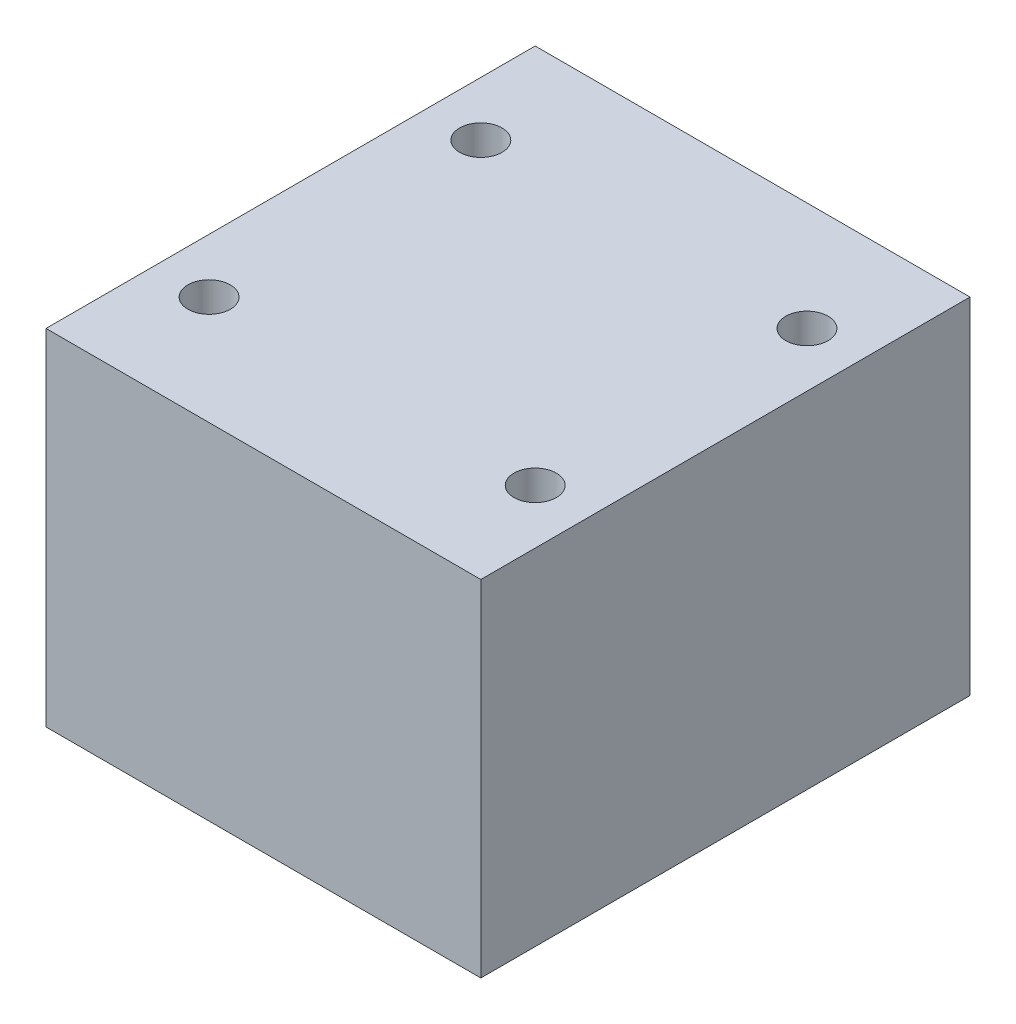
ISO-10303-21;
HEADER;
FILE_DESCRIPTION(('STEP AP214'),'2;1');
FILE_NAME('part.step','',(''),(''),'','','');
FILE_SCHEMA(('AUTOMOTIVE_DESIGN { 1 0 10303 214 1 1 1 1 }'));
ENDSEC;
DATA;
#1=APPLICATION_CONTEXT('core data for automotive mechanical design processes');
#2=APPLICATION_PROTOCOL_DEFINITION('international standard','automotive_design',2000,#1);
#3=PRODUCT_CONTEXT('',#1,'mechanical');
#4=PRODUCT('Part','Part','',(#3));
#5=PRODUCT_RELATED_PRODUCT_CATEGORY('part','',(#4));
#6=PRODUCT_DEFINITION_FORMATION('','',#4);
#7=PRODUCT_DEFINITION_CONTEXT('part definition',#1,'design');
#8=PRODUCT_DEFINITION('design','',#6,#7);
#9=PRODUCT_DEFINITION_SHAPE('','',#8);
#10=(LENGTH_UNIT() NAMED_UNIT(*) SI_UNIT(.MILLI.,.METRE.));
#11=(NAMED_UNIT(*) PLANE_ANGLE_UNIT() SI_UNIT($,.RADIAN.));
#12=(NAMED_UNIT(*) SI_UNIT($,.STERADIAN.) SOLID_ANGLE_UNIT());
#13=UNCERTAINTY_MEASURE_WITH_UNIT(LENGTH_MEASURE(1.E-05),#10,'distance_accuracy_value','');
#14=(GEOMETRIC_REPRESENTATION_CONTEXT(3) GLOBAL_UNCERTAINTY_ASSIGNED_CONTEXT((#13)) GLOBAL_UNIT_ASSIGNED_CONTEXT((#10,
#11,#12)) REPRESENTATION_CONTEXT('',''));
#15=CARTESIAN_POINT('',(0.,0.,0.));
#16=DIRECTION('',(0.,0.,1.));
#17=DIRECTION('',(1.,0.,0.));
#18=AXIS2_PLACEMENT_3D('',#15,#16,#17);
#19=CARTESIAN_POINT('',(0.,31.75,0.));
#20=DIRECTION('',(0.,-1.,0.));
#21=DIRECTION('',(0.,0.,-1.));
#22=AXIS2_PLACEMENT_3D('',#19,#20,#21);
#23=PLANE('',#22);
#24=DIRECTION('',(0.,0.,1.));
#25=VECTOR('',#24,1.);
#26=CARTESIAN_POINT('',(-10.8661157330131,31.75,15.721947224945));
#27=LINE('',#26,#25);
#28=CARTESIAN_POINT('',(-10.8661157330131,31.75,-29.278052775055));
#29=VERTEX_POINT('',#28);
#30=CARTESIAN_POINT('',(-10.8661157330131,31.75,15.721947224945));
#31=VERTEX_POINT('',#30);
#32=EDGE_CURVE('E97',#29,#31,#27,.T.);
#33=ORIENTED_EDGE('',*,*,#32,.T.);
#34=DIRECTION('',(1.,0.,0.));
#35=VECTOR('',#34,1.);
#36=CARTESIAN_POINT('',(-10.8661157330131,31.75,15.721947224945));
#37=LINE('',#36,#35);
#38=CARTESIAN_POINT('',(29.1338842669869,31.75,15.721947224945));
#39=VERTEX_POINT('',#38);
#40=EDGE_CURVE('E93',#31,#39,#37,.T.);
#41=ORIENTED_EDGE('',*,*,#40,.T.);
#42=DIRECTION('',(0.,0.,-1.));
#43=VECTOR('',#42,1.);
#44=CARTESIAN_POINT('',(29.1338842669869,31.75,15.721947224945));
#45=LINE('',#44,#43);
#46=CARTESIAN_POINT('',(29.1338842669869,31.75,-29.278052775055));
#47=VERTEX_POINT('',#46);
#48=EDGE_CURVE('E96',#39,#47,#45,.T.);
#49=ORIENTED_EDGE('',*,*,#48,.T.);
#50=DIRECTION('',(-1.,0.,0.));
#51=VECTOR('',#50,1.);
#52=CARTESIAN_POINT('',(-10.8661157330131,31.75,-29.278052775055));
#53=LINE('',#52,#51);
#54=EDGE_CURVE('E64',#47,#29,#53,.T.);
#55=ORIENTED_EDGE('',*,*,#54,.T.);
#56=EDGE_LOOP('',(#33,#41,#49,#55));
#57=FACE_BOUND('',#56,.T.);
#58=CARTESIAN_POINT('',(-5.86611573301306,31.75,-19.278052775055));
#59=DIRECTION('',(0.,1.,0.));
#60=DIRECTION('',(0.,0.,1.));
#61=AXIS2_PLACEMENT_3D('',#58,#59,#60);
#62=CIRCLE('',#61,1.95);
#63=CARTESIAN_POINT('',(-5.86611573301306,31.75,-17.328052775055));
#64=VERTEX_POINT('',#63);
#65=EDGE_CURVE('E119',#64,#64,#62,.T.);
#66=ORIENTED_EDGE('',*,*,#65,.F.);
#67=EDGE_LOOP('',(#66));
#68=FACE_BOUND('',#67,.T.);
#69=CARTESIAN_POINT('',(24.1338842669869,31.75,-19.278052775055));
#70=DIRECTION('',(0.,1.,0.));
#71=DIRECTION('',(0.,0.,1.));
#72=AXIS2_PLACEMENT_3D('',#69,#70,#71);
#73=CIRCLE('',#72,1.95);
#74=CARTESIAN_POINT('',(24.1338842669869,31.75,-17.328052775055));
#75=VERTEX_POINT('',#74);
#76=EDGE_CURVE('E139',#75,#75,#73,.T.);
#77=ORIENTED_EDGE('',*,*,#76,.F.);
#78=EDGE_LOOP('',(#77));
#79=FACE_BOUND('',#78,.T.);
#80=CARTESIAN_POINT('',(24.1338842669869,31.75,5.72194722494503));
#81=DIRECTION('',(0.,1.,0.));
#82=DIRECTION('',(0.,0.,1.));
#83=AXIS2_PLACEMENT_3D('',#80,#81,#82);
#84=CIRCLE('',#83,1.95);
#85=CARTESIAN_POINT('',(24.1338842669869,31.75,7.67194722494503));
#86=VERTEX_POINT('',#85);
#87=EDGE_CURVE('E149',#86,#86,#84,.T.);
#88=ORIENTED_EDGE('',*,*,#87,.F.);
#89=EDGE_LOOP('',(#88));
#90=FACE_BOUND('',#89,.T.);
#91=CARTESIAN_POINT('',(-5.86611573301306,31.75,5.72194722494503));
#92=DIRECTION('',(0.,1.,0.));
#93=DIRECTION('',(0.,0.,1.));
#94=AXIS2_PLACEMENT_3D('',#91,#92,#93);
#95=CIRCLE('',#94,1.95);
#96=CARTESIAN_POINT('',(-5.86611573301306,31.75,7.67194722494503));
#97=VERTEX_POINT('',#96);
#98=EDGE_CURVE('E157',#97,#97,#95,.T.);
#99=ORIENTED_EDGE('',*,*,#98,.F.);
#100=EDGE_LOOP('',(#99));
#101=FACE_BOUND('',#100,.T.);
#102=ADVANCED_FACE('F44',(#57,#68,#79,#90,#101),#23,.F.);
#103=CARTESIAN_POINT('',(0.,0.,0.));
#104=DIRECTION('',(0.,-1.,0.));
#105=DIRECTION('',(0.,0.,-1.));
#106=AXIS2_PLACEMENT_3D('',#103,#104,#105);
#107=PLANE('',#106);
#108=CARTESIAN_POINT('',(24.1338842669869,0.,5.72194722494503));
#109=DIRECTION('',(0.,1.,0.));
#110=DIRECTION('',(0.,0.,1.));
#111=AXIS2_PLACEMENT_3D('',#108,#109,#110);
#112=CIRCLE('',#111,1.95);
#113=CARTESIAN_POINT('',(24.1338842669869,0.,7.67194722494503));
#114=VERTEX_POINT('',#113);
#115=EDGE_CURVE('E152',#114,#114,#112,.T.);
#116=ORIENTED_EDGE('',*,*,#115,.T.);
#117=EDGE_LOOP('',(#116));
#118=FACE_BOUND('',#117,.T.);
#119=CARTESIAN_POINT('',(-5.86611573301306,0.,-19.278052775055));
#120=DIRECTION('',(0.,1.,0.));
#121=DIRECTION('',(0.,0.,1.));
#122=AXIS2_PLACEMENT_3D('',#119,#120,#121);
#123=CIRCLE('',#122,1.95);
#124=CARTESIAN_POINT('',(-5.86611573301306,0.,-17.328052775055));
#125=VERTEX_POINT('',#124);
#126=EDGE_CURVE('E136',#125,#125,#123,.T.);
#127=ORIENTED_EDGE('',*,*,#126,.T.);
#128=EDGE_LOOP('',(#127));
#129=FACE_BOUND('',#128,.T.);
#130=DIRECTION('',(0.,0.,1.));
#131=VECTOR('',#130,1.);
#132=CARTESIAN_POINT('',(-10.8661157330131,0.,15.721947224945));
#133=LINE('',#132,#131);
#134=CARTESIAN_POINT('',(-10.8661157330131,0.,-29.278052775055));
#135=VERTEX_POINT('',#134);
#136=CARTESIAN_POINT('',(-10.8661157330131,0.,15.721947224945));
#137=VERTEX_POINT('',#136);
#138=EDGE_CURVE('E114',#135,#137,#133,.T.);
#139=ORIENTED_EDGE('',*,*,#138,.F.);
#140=DIRECTION('',(-1.,0.,0.));
#141=VECTOR('',#140,1.);
#142=CARTESIAN_POINT('',(-10.8661157330131,0.,-29.278052775055));
#143=LINE('',#142,#141);
#144=CARTESIAN_POINT('',(29.1338842669869,0.,-29.278052775055));
#145=VERTEX_POINT('',#144);
#146=EDGE_CURVE('E86',#145,#135,#143,.T.);
#147=ORIENTED_EDGE('',*,*,#146,.F.);
#148=DIRECTION('',(0.,0.,-1.));
#149=VECTOR('',#148,1.);
#150=CARTESIAN_POINT('',(29.1338842669869,0.,15.721947224945));
#151=LINE('',#150,#149);
#152=CARTESIAN_POINT('',(29.1338842669869,0.,15.721947224945));
#153=VERTEX_POINT('',#152);
#154=EDGE_CURVE('E79',#153,#145,#151,.T.);
#155=ORIENTED_EDGE('',*,*,#154,.F.);
#156=DIRECTION('',(1.,0.,0.));
#157=VECTOR('',#156,1.);
#158=CARTESIAN_POINT('',(-10.8661157330131,0.,15.721947224945));
#159=LINE('',#158,#157);
#160=EDGE_CURVE('E104',#137,#153,#159,.T.);
#161=ORIENTED_EDGE('',*,*,#160,.F.);
#162=EDGE_LOOP('',(#139,#147,#155,#161));
#163=FACE_BOUND('',#162,.T.);
#164=CARTESIAN_POINT('',(24.1338842669869,0.,-19.278052775055));
#165=DIRECTION('',(0.,1.,0.));
#166=DIRECTION('',(0.,0.,1.));
#167=AXIS2_PLACEMENT_3D('',#164,#165,#166);
#168=CIRCLE('',#167,1.95);
#169=CARTESIAN_POINT('',(24.1338842669869,0.,-17.328052775055));
#170=VERTEX_POINT('',#169);
#171=EDGE_CURVE('E143',#170,#170,#168,.T.);
#172=ORIENTED_EDGE('',*,*,#171,.T.);
#173=EDGE_LOOP('',(#172));
#174=FACE_BOUND('',#173,.T.);
#175=CARTESIAN_POINT('',(-5.86611573301306,0.,5.72194722494503));
#176=DIRECTION('',(0.,1.,0.));
#177=DIRECTION('',(0.,0.,1.));
#178=AXIS2_PLACEMENT_3D('',#175,#176,#177);
#179=CIRCLE('',#178,1.95);
#180=CARTESIAN_POINT('',(-5.86611573301306,0.,7.67194722494503));
#181=VERTEX_POINT('',#180);
#182=EDGE_CURVE('E158',#181,#181,#179,.T.);
#183=ORIENTED_EDGE('',*,*,#182,.T.);
#184=EDGE_LOOP('',(#183));
#185=FACE_BOUND('',#184,.T.);
#186=ADVANCED_FACE('F131',(#118,#129,#163,#174,#185),#107,.T.);
#187=CARTESIAN_POINT('',(-10.8661157330131,31.75,15.721947224945));
#188=DIRECTION('',(1.,0.,0.));
#189=DIRECTION('',(0.,0.,-1.));
#190=AXIS2_PLACEMENT_3D('',#187,#188,#189);
#191=PLANE('',#190);
#192=ORIENTED_EDGE('',*,*,#138,.T.);
#193=DIRECTION('',(0.,-1.,0.));
#194=VECTOR('',#193,1.);
#195=CARTESIAN_POINT('',(-10.8661157330131,31.75,15.721947224945));
#196=LINE('',#195,#194);
#197=EDGE_CURVE('E11',#31,#137,#196,.T.);
#198=ORIENTED_EDGE('',*,*,#197,.F.);
#199=ORIENTED_EDGE('',*,*,#32,.F.);
#200=DIRECTION('',(0.,-1.,0.));
#201=VECTOR('',#200,1.);
#202=CARTESIAN_POINT('',(-10.8661157330131,31.75,-29.278052775055));
#203=LINE('',#202,#201);
#204=EDGE_CURVE('E110',#29,#135,#203,.T.);
#205=ORIENTED_EDGE('',*,*,#204,.T.);
#206=EDGE_LOOP('',(#192,#198,#199,#205));
#207=FACE_BOUND('',#206,.T.);
#208=ADVANCED_FACE('F50',(#207),#191,.F.);
#209=CARTESIAN_POINT('',(-10.8661157330131,31.75,15.721947224945));
#210=DIRECTION('',(0.,0.,-1.));
#211=DIRECTION('',(-1.,0.,0.));
#212=AXIS2_PLACEMENT_3D('',#209,#210,#211);
#213=PLANE('',#212);
#214=ORIENTED_EDGE('',*,*,#160,.T.);
#215=DIRECTION('',(0.,-1.,0.));
#216=VECTOR('',#215,1.);
#217=CARTESIAN_POINT('',(29.1338842669869,31.75,15.721947224945));
#218=LINE('',#217,#216);
#219=EDGE_CURVE('E54',#39,#153,#218,.T.);
#220=ORIENTED_EDGE('',*,*,#219,.F.);
#221=ORIENTED_EDGE('',*,*,#40,.F.);
#222=ORIENTED_EDGE('',*,*,#197,.T.);
#223=EDGE_LOOP('',(#214,#220,#221,#222));
#224=FACE_BOUND('',#223,.T.);
#225=ADVANCED_FACE('F105',(#224),#213,.F.);
#226=CARTESIAN_POINT('',(29.1338842669869,31.75,15.721947224945));
#227=DIRECTION('',(-1.,0.,0.));
#228=DIRECTION('',(0.,0.,1.));
#229=AXIS2_PLACEMENT_3D('',#226,#227,#228);
#230=PLANE('',#229);
#231=ORIENTED_EDGE('',*,*,#154,.T.);
#232=DIRECTION('',(0.,-1.,0.));
#233=VECTOR('',#232,1.);
#234=CARTESIAN_POINT('',(29.1338842669869,31.75,-29.278052775055));
#235=LINE('',#234,#233);
#236=EDGE_CURVE('E103',#47,#145,#235,.T.);
#237=ORIENTED_EDGE('',*,*,#236,.F.);
#238=ORIENTED_EDGE('',*,*,#48,.F.);
#239=ORIENTED_EDGE('',*,*,#219,.T.);
#240=EDGE_LOOP('',(#231,#237,#238,#239));
#241=FACE_BOUND('',#240,.T.);
#242=ADVANCED_FACE('F106',(#241),#230,.F.);
#243=CARTESIAN_POINT('',(-10.8661157330131,31.75,-29.278052775055));
#244=DIRECTION('',(0.,0.,1.));
#245=DIRECTION('',(1.,0.,0.));
#246=AXIS2_PLACEMENT_3D('',#243,#244,#245);
#247=PLANE('',#246);
#248=ORIENTED_EDGE('',*,*,#146,.T.);
#249=ORIENTED_EDGE('',*,*,#204,.F.);
#250=ORIENTED_EDGE('',*,*,#54,.F.);
#251=ORIENTED_EDGE('',*,*,#236,.T.);
#252=EDGE_LOOP('',(#248,#249,#250,#251));
#253=FACE_BOUND('',#252,.T.);
#254=ADVANCED_FACE('F126',(#253),#247,.F.);
#255=CARTESIAN_POINT('',(-5.86611573301306,31.75,-19.278052775055));
#256=DIRECTION('',(0.,-1.,0.));
#257=DIRECTION('',(0.,0.,-1.));
#258=AXIS2_PLACEMENT_3D('',#255,#256,#257);
#259=CYLINDRICAL_SURFACE('',#258,1.95);
#260=ORIENTED_EDGE('',*,*,#65,.T.);
#261=EDGE_LOOP('',(#260));
#262=FACE_BOUND('',#261,.T.);
#263=ORIENTED_EDGE('',*,*,#126,.F.);
#264=EDGE_LOOP('',(#263));
#265=FACE_BOUND('',#264,.T.);
#266=ADVANCED_FACE('F177',(#262,#265),#259,.F.);
#267=CARTESIAN_POINT('',(24.1338842669869,31.75,-19.278052775055));
#268=DIRECTION('',(0.,-1.,0.));
#269=DIRECTION('',(0.,0.,-1.));
#270=AXIS2_PLACEMENT_3D('',#267,#268,#269);
#271=CYLINDRICAL_SURFACE('',#270,1.95);
#272=ORIENTED_EDGE('',*,*,#76,.T.);
#273=EDGE_LOOP('',(#272));
#274=FACE_BOUND('',#273,.T.);
#275=ORIENTED_EDGE('',*,*,#171,.F.);
#276=EDGE_LOOP('',(#275));
#277=FACE_BOUND('',#276,.T.);
#278=ADVANCED_FACE('F222',(#274,#277),#271,.F.);
#279=CARTESIAN_POINT('',(24.1338842669869,31.75,5.72194722494503));
#280=DIRECTION('',(0.,-1.,0.));
#281=DIRECTION('',(0.,0.,-1.));
#282=AXIS2_PLACEMENT_3D('',#279,#280,#281);
#283=CYLINDRICAL_SURFACE('',#282,1.95);
#284=ORIENTED_EDGE('',*,*,#87,.T.);
#285=EDGE_LOOP('',(#284));
#286=FACE_BOUND('',#285,.T.);
#287=ORIENTED_EDGE('',*,*,#115,.F.);
#288=EDGE_LOOP('',(#287));
#289=FACE_BOUND('',#288,.T.);
#290=ADVANCED_FACE('F235',(#286,#289),#283,.F.);
#291=CARTESIAN_POINT('',(-5.86611573301306,31.75,5.72194722494503));
#292=DIRECTION('',(0.,-1.,0.));
#293=DIRECTION('',(0.,0.,-1.));
#294=AXIS2_PLACEMENT_3D('',#291,#292,#293);
#295=CYLINDRICAL_SURFACE('',#294,1.95);
#296=ORIENTED_EDGE('',*,*,#98,.T.);
#297=EDGE_LOOP('',(#296));
#298=FACE_BOUND('',#297,.T.);
#299=ORIENTED_EDGE('',*,*,#182,.F.);
#300=EDGE_LOOP('',(#299));
#301=FACE_BOUND('',#300,.T.);
#302=ADVANCED_FACE('F166',(#298,#301),#295,.F.);
#303=CLOSED_SHELL('',(#102,#186,#208,#225,#242,#254,#266,#278,#290,#302));
#304=MANIFOLD_SOLID_BREP('B2',#303);
#305=ADVANCED_BREP_SHAPE_REPRESENTATION('',(#18,#304),#14);
#306=SHAPE_DEFINITION_REPRESENTATION(#9,#305);
ENDSEC;
END-ISO-10303-21;
